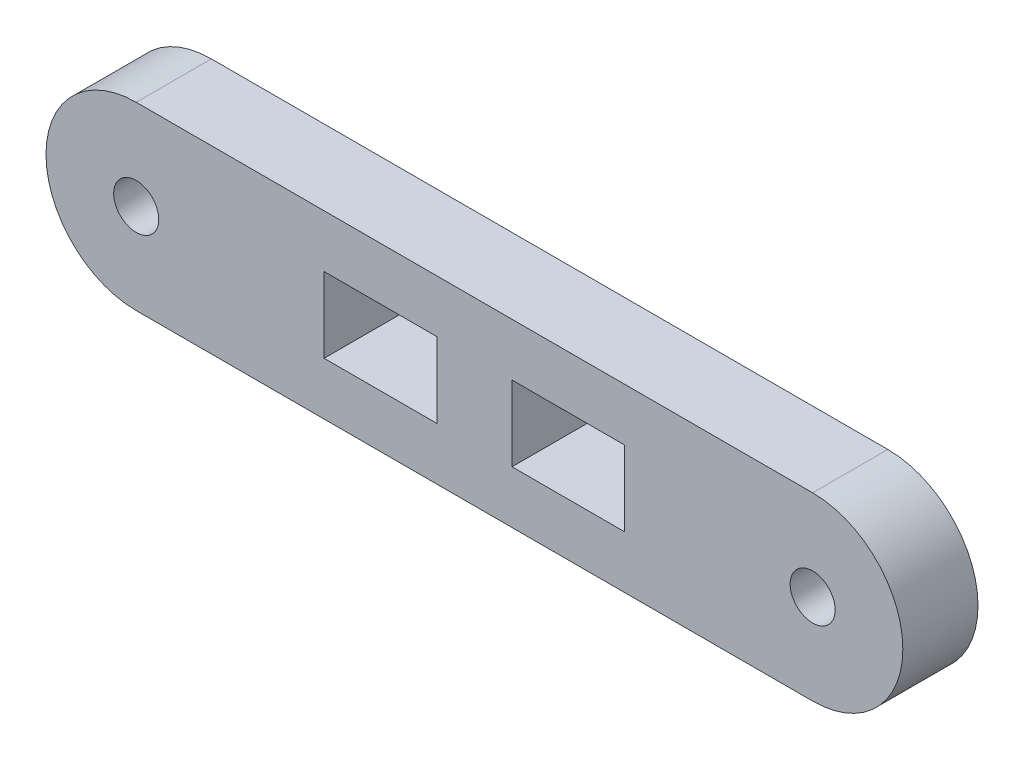
ISO-10303-21;
HEADER;
FILE_DESCRIPTION(('STEP AP214'),'2;1');
FILE_NAME('part.step','',(''),(''),'','','');
FILE_SCHEMA(('AUTOMOTIVE_DESIGN { 1 0 10303 214 1 1 1 1 }'));
ENDSEC;
DATA;
#1=APPLICATION_CONTEXT('core data for automotive mechanical design processes');
#2=APPLICATION_PROTOCOL_DEFINITION('international standard','automotive_design',2000,#1);
#3=PRODUCT_CONTEXT('',#1,'mechanical');
#4=PRODUCT('Part','Part','',(#3));
#5=PRODUCT_RELATED_PRODUCT_CATEGORY('part','',(#4));
#6=PRODUCT_DEFINITION_FORMATION('','',#4);
#7=PRODUCT_DEFINITION_CONTEXT('part definition',#1,'design');
#8=PRODUCT_DEFINITION('design','',#6,#7);
#9=PRODUCT_DEFINITION_SHAPE('','',#8);
#10=(LENGTH_UNIT() NAMED_UNIT(*) SI_UNIT(.MILLI.,.METRE.));
#11=(NAMED_UNIT(*) PLANE_ANGLE_UNIT() SI_UNIT($,.RADIAN.));
#12=(NAMED_UNIT(*) SI_UNIT($,.STERADIAN.) SOLID_ANGLE_UNIT());
#13=UNCERTAINTY_MEASURE_WITH_UNIT(LENGTH_MEASURE(1.E-05),#10,'distance_accuracy_value','');
#14=(GEOMETRIC_REPRESENTATION_CONTEXT(3) GLOBAL_UNCERTAINTY_ASSIGNED_CONTEXT((#13)) GLOBAL_UNIT_ASSIGNED_CONTEXT((#10,
#11,#12)) REPRESENTATION_CONTEXT('',''));
#15=CARTESIAN_POINT('',(0.,0.,0.));
#16=DIRECTION('',(0.,0.,1.));
#17=DIRECTION('',(1.,0.,0.));
#18=AXIS2_PLACEMENT_3D('',#15,#16,#17);
#19=CARTESIAN_POINT('',(0.,0.,5.));
#20=DIRECTION('',(0.,0.,1.));
#21=DIRECTION('',(1.,0.,0.));
#22=AXIS2_PLACEMENT_3D('',#19,#20,#21);
#23=PLANE('',#22);
#24=DIRECTION('',(-1.,0.,0.));
#25=VECTOR('',#24,1.);
#26=CARTESIAN_POINT('',(25.,2.50000000000001,5.));
#27=LINE('',#26,#25);
#28=CARTESIAN_POINT('',(32.5,2.49999999999999,5.));
#29=VERTEX_POINT('',#28);
#30=CARTESIAN_POINT('',(25.,2.50000000000001,5.));
#31=VERTEX_POINT('',#30);
#32=EDGE_CURVE('E160',#29,#31,#27,.T.);
#33=ORIENTED_EDGE('',*,*,#32,.F.);
#34=DIRECTION('',(0.,1.,0.));
#35=VECTOR('',#34,1.);
#36=CARTESIAN_POINT('',(32.5,2.49999999999999,5.));
#37=LINE('',#36,#35);
#38=CARTESIAN_POINT('',(32.5,-2.49999999999999,5.));
#39=VERTEX_POINT('',#38);
#40=EDGE_CURVE('E158',#39,#29,#37,.T.);
#41=ORIENTED_EDGE('',*,*,#40,.F.);
#42=DIRECTION('',(1.,0.,0.));
#43=VECTOR('',#42,1.);
#44=CARTESIAN_POINT('',(32.5,-2.49999999999999,5.));
#45=LINE('',#44,#43);
#46=CARTESIAN_POINT('',(25.,-2.49999999999999,5.));
#47=VERTEX_POINT('',#46);
#48=EDGE_CURVE('E166',#47,#39,#45,.T.);
#49=ORIENTED_EDGE('',*,*,#48,.F.);
#50=DIRECTION('',(0.,-1.,0.));
#51=VECTOR('',#50,1.);
#52=CARTESIAN_POINT('',(25.,-2.49999999999999,5.));
#53=LINE('',#52,#51);
#54=EDGE_CURVE('E163',#31,#47,#53,.T.);
#55=ORIENTED_EDGE('',*,*,#54,.F.);
#56=EDGE_LOOP('',(#33,#41,#49,#55));
#57=FACE_BOUND('',#56,.T.);
#58=CARTESIAN_POINT('',(45.,0.,5.));
#59=DIRECTION('',(0.,0.,1.));
#60=DIRECTION('',(1.,0.,0.));
#61=AXIS2_PLACEMENT_3D('',#58,#59,#60);
#62=CIRCLE('',#61,1.5);
#63=CARTESIAN_POINT('',(46.5,0.,5.));
#64=VERTEX_POINT('',#63);
#65=EDGE_CURVE('E195',#64,#64,#62,.T.);
#66=ORIENTED_EDGE('',*,*,#65,.F.);
#67=EDGE_LOOP('',(#66));
#68=FACE_BOUND('',#67,.T.);
#69=CARTESIAN_POINT('',(0.,0.,5.));
#70=DIRECTION('',(0.,0.,1.));
#71=DIRECTION('',(1.,0.,0.));
#72=AXIS2_PLACEMENT_3D('',#69,#70,#71);
#73=CIRCLE('',#72,5.99999999999998);
#74=CARTESIAN_POINT('',(0.,5.99999999999998,5.));
#75=VERTEX_POINT('',#74);
#76=CARTESIAN_POINT('',(0.,-5.99999999999998,5.));
#77=VERTEX_POINT('',#76);
#78=EDGE_CURVE('E201',#75,#77,#73,.T.);
#79=ORIENTED_EDGE('',*,*,#78,.T.);
#80=DIRECTION('',(1.,0.,0.));
#81=VECTOR('',#80,1.);
#82=CARTESIAN_POINT('',(0.,-5.99999999999998,5.));
#83=LINE('',#82,#81);
#84=CARTESIAN_POINT('',(45.,-5.99999999999999,5.));
#85=VERTEX_POINT('',#84);
#86=EDGE_CURVE('E204',#77,#85,#83,.T.);
#87=ORIENTED_EDGE('',*,*,#86,.T.);
#88=CARTESIAN_POINT('',(45.,0.,5.));
#89=DIRECTION('',(0.,0.,1.));
#90=DIRECTION('',(1.,0.,0.));
#91=AXIS2_PLACEMENT_3D('',#88,#89,#90);
#92=CIRCLE('',#91,5.99999999999999);
#93=CARTESIAN_POINT('',(45.,5.99999999999999,5.));
#94=VERTEX_POINT('',#93);
#95=EDGE_CURVE('E207',#85,#94,#92,.T.);
#96=ORIENTED_EDGE('',*,*,#95,.T.);
#97=DIRECTION('',(-1.,0.,0.));
#98=VECTOR('',#97,1.);
#99=CARTESIAN_POINT('',(0.,5.99999999999998,5.));
#100=LINE('',#99,#98);
#101=EDGE_CURVE('E209',#94,#75,#100,.T.);
#102=ORIENTED_EDGE('',*,*,#101,.T.);
#103=EDGE_LOOP('',(#79,#87,#96,#102));
#104=FACE_BOUND('',#103,.T.);
#105=CARTESIAN_POINT('',(0.,0.,5.));
#106=DIRECTION('',(0.,0.,1.));
#107=DIRECTION('',(1.,0.,0.));
#108=AXIS2_PLACEMENT_3D('',#105,#106,#107);
#109=CIRCLE('',#108,1.5);
#110=CARTESIAN_POINT('',(1.5,0.,5.));
#111=VERTEX_POINT('',#110);
#112=EDGE_CURVE('E189',#111,#111,#109,.T.);
#113=ORIENTED_EDGE('',*,*,#112,.F.);
#114=EDGE_LOOP('',(#113));
#115=FACE_BOUND('',#114,.T.);
#116=DIRECTION('',(0.,-1.,0.));
#117=VECTOR('',#116,1.);
#118=CARTESIAN_POINT('',(12.5,2.49999999999999,5.));
#119=LINE('',#118,#117);
#120=CARTESIAN_POINT('',(12.5,2.49999999999999,5.));
#121=VERTEX_POINT('',#120);
#122=CARTESIAN_POINT('',(12.5,-2.49999999999999,5.));
#123=VERTEX_POINT('',#122);
#124=EDGE_CURVE('E130',#121,#123,#119,.T.);
#125=ORIENTED_EDGE('',*,*,#124,.F.);
#126=DIRECTION('',(-1.,0.,0.));
#127=VECTOR('',#126,1.);
#128=CARTESIAN_POINT('',(20.,2.49999999999999,5.));
#129=LINE('',#128,#127);
#130=CARTESIAN_POINT('',(20.,2.49999999999999,5.));
#131=VERTEX_POINT('',#130);
#132=EDGE_CURVE('E122',#131,#121,#129,.T.);
#133=ORIENTED_EDGE('',*,*,#132,.F.);
#134=DIRECTION('',(0.,1.,0.));
#135=VECTOR('',#134,1.);
#136=CARTESIAN_POINT('',(20.,-2.5,5.));
#137=LINE('',#136,#135);
#138=CARTESIAN_POINT('',(20.,-2.5,5.));
#139=VERTEX_POINT('',#138);
#140=EDGE_CURVE('E144',#139,#131,#137,.T.);
#141=ORIENTED_EDGE('',*,*,#140,.F.);
#142=DIRECTION('',(1.,0.,0.));
#143=VECTOR('',#142,1.);
#144=CARTESIAN_POINT('',(12.5,-2.49999999999999,5.));
#145=LINE('',#144,#143);
#146=EDGE_CURVE('E142',#123,#139,#145,.T.);
#147=ORIENTED_EDGE('',*,*,#146,.F.);
#148=EDGE_LOOP('',(#125,#133,#141,#147));
#149=FACE_BOUND('',#148,.T.);
#150=ADVANCED_FACE('F33',(#57,#68,#104,#115,#149),#23,.T.);
#151=CARTESIAN_POINT('',(0.,0.,0.));
#152=DIRECTION('',(0.,0.,1.));
#153=DIRECTION('',(1.,0.,0.));
#154=AXIS2_PLACEMENT_3D('',#151,#152,#153);
#155=PLANE('',#154);
#156=DIRECTION('',(0.,1.,0.));
#157=VECTOR('',#156,1.);
#158=CARTESIAN_POINT('',(32.5,2.49999999999999,0.));
#159=LINE('',#158,#157);
#160=CARTESIAN_POINT('',(32.5,-2.49999999999999,0.));
#161=VERTEX_POINT('',#160);
#162=CARTESIAN_POINT('',(32.5,2.49999999999999,0.));
#163=VERTEX_POINT('',#162);
#164=EDGE_CURVE('E138',#161,#163,#159,.T.);
#165=ORIENTED_EDGE('',*,*,#164,.T.);
#166=DIRECTION('',(-1.,0.,0.));
#167=VECTOR('',#166,1.);
#168=CARTESIAN_POINT('',(25.,2.50000000000001,0.));
#169=LINE('',#168,#167);
#170=CARTESIAN_POINT('',(25.,2.50000000000001,0.));
#171=VERTEX_POINT('',#170);
#172=EDGE_CURVE('E171',#163,#171,#169,.T.);
#173=ORIENTED_EDGE('',*,*,#172,.T.);
#174=DIRECTION('',(0.,-1.,0.));
#175=VECTOR('',#174,1.);
#176=CARTESIAN_POINT('',(25.,-2.49999999999999,0.));
#177=LINE('',#176,#175);
#178=CARTESIAN_POINT('',(25.,-2.49999999999999,0.));
#179=VERTEX_POINT('',#178);
#180=EDGE_CURVE('E174',#171,#179,#177,.T.);
#181=ORIENTED_EDGE('',*,*,#180,.T.);
#182=DIRECTION('',(1.,0.,0.));
#183=VECTOR('',#182,1.);
#184=CARTESIAN_POINT('',(32.5,-2.49999999999999,0.));
#185=LINE('',#184,#183);
#186=EDGE_CURVE('E161',#179,#161,#185,.T.);
#187=ORIENTED_EDGE('',*,*,#186,.T.);
#188=EDGE_LOOP('',(#165,#173,#181,#187));
#189=FACE_BOUND('',#188,.T.);
#190=CARTESIAN_POINT('',(45.,0.,0.));
#191=DIRECTION('',(0.,0.,1.));
#192=DIRECTION('',(1.,0.,0.));
#193=AXIS2_PLACEMENT_3D('',#190,#191,#192);
#194=CIRCLE('',#193,1.5);
#195=CARTESIAN_POINT('',(46.5,0.,0.));
#196=VERTEX_POINT('',#195);
#197=EDGE_CURVE('E192',#196,#196,#194,.T.);
#198=ORIENTED_EDGE('',*,*,#197,.T.);
#199=EDGE_LOOP('',(#198));
#200=FACE_BOUND('',#199,.T.);
#201=CARTESIAN_POINT('',(0.,0.,0.));
#202=DIRECTION('',(0.,0.,1.));
#203=DIRECTION('',(1.,0.,0.));
#204=AXIS2_PLACEMENT_3D('',#201,#202,#203);
#205=CIRCLE('',#204,5.99999999999998);
#206=CARTESIAN_POINT('',(0.,5.99999999999998,0.));
#207=VERTEX_POINT('',#206);
#208=CARTESIAN_POINT('',(0.,-5.99999999999998,0.));
#209=VERTEX_POINT('',#208);
#210=EDGE_CURVE('E198',#207,#209,#205,.T.);
#211=ORIENTED_EDGE('',*,*,#210,.F.);
#212=DIRECTION('',(-1.,0.,0.));
#213=VECTOR('',#212,1.);
#214=CARTESIAN_POINT('',(0.,5.99999999999998,0.));
#215=LINE('',#214,#213);
#216=CARTESIAN_POINT('',(45.,5.99999999999999,0.));
#217=VERTEX_POINT('',#216);
#218=EDGE_CURVE('E205',#217,#207,#215,.T.);
#219=ORIENTED_EDGE('',*,*,#218,.F.);
#220=CARTESIAN_POINT('',(45.,0.,0.));
#221=DIRECTION('',(0.,0.,1.));
#222=DIRECTION('',(1.,0.,0.));
#223=AXIS2_PLACEMENT_3D('',#220,#221,#222);
#224=CIRCLE('',#223,5.99999999999999);
#225=CARTESIAN_POINT('',(45.,-5.99999999999999,0.));
#226=VERTEX_POINT('',#225);
#227=EDGE_CURVE('E216',#226,#217,#224,.T.);
#228=ORIENTED_EDGE('',*,*,#227,.F.);
#229=DIRECTION('',(1.,0.,0.));
#230=VECTOR('',#229,1.);
#231=CARTESIAN_POINT('',(0.,-5.99999999999998,0.));
#232=LINE('',#231,#230);
#233=EDGE_CURVE('E214',#209,#226,#232,.T.);
#234=ORIENTED_EDGE('',*,*,#233,.F.);
#235=EDGE_LOOP('',(#211,#219,#228,#234));
#236=FACE_BOUND('',#235,.T.);
#237=CARTESIAN_POINT('',(0.,0.,0.));
#238=DIRECTION('',(0.,0.,1.));
#239=DIRECTION('',(1.,0.,0.));
#240=AXIS2_PLACEMENT_3D('',#237,#238,#239);
#241=CIRCLE('',#240,1.5);
#242=CARTESIAN_POINT('',(1.5,0.,0.));
#243=VERTEX_POINT('',#242);
#244=EDGE_CURVE('E188',#243,#243,#241,.T.);
#245=ORIENTED_EDGE('',*,*,#244,.T.);
#246=EDGE_LOOP('',(#245));
#247=FACE_BOUND('',#246,.T.);
#248=DIRECTION('',(-1.,0.,0.));
#249=VECTOR('',#248,1.);
#250=CARTESIAN_POINT('',(20.,2.49999999999999,0.));
#251=LINE('',#250,#249);
#252=CARTESIAN_POINT('',(20.,2.49999999999999,0.));
#253=VERTEX_POINT('',#252);
#254=CARTESIAN_POINT('',(12.5,2.49999999999999,0.));
#255=VERTEX_POINT('',#254);
#256=EDGE_CURVE('E56',#253,#255,#251,.T.);
#257=ORIENTED_EDGE('',*,*,#256,.T.);
#258=DIRECTION('',(0.,-1.,0.));
#259=VECTOR('',#258,1.);
#260=CARTESIAN_POINT('',(12.5,2.49999999999999,0.));
#261=LINE('',#260,#259);
#262=CARTESIAN_POINT('',(12.5,-2.49999999999999,0.));
#263=VERTEX_POINT('',#262);
#264=EDGE_CURVE('E137',#255,#263,#261,.T.);
#265=ORIENTED_EDGE('',*,*,#264,.T.);
#266=DIRECTION('',(1.,0.,0.));
#267=VECTOR('',#266,1.);
#268=CARTESIAN_POINT('',(12.5,-2.49999999999999,0.));
#269=LINE('',#268,#267);
#270=CARTESIAN_POINT('',(20.,-2.5,0.));
#271=VERTEX_POINT('',#270);
#272=EDGE_CURVE('E150',#263,#271,#269,.T.);
#273=ORIENTED_EDGE('',*,*,#272,.T.);
#274=DIRECTION('',(0.,1.,0.));
#275=VECTOR('',#274,1.);
#276=CARTESIAN_POINT('',(20.,-2.5,0.));
#277=LINE('',#276,#275);
#278=EDGE_CURVE('E131',#271,#253,#277,.T.);
#279=ORIENTED_EDGE('',*,*,#278,.T.);
#280=EDGE_LOOP('',(#257,#265,#273,#279));
#281=FACE_BOUND('',#280,.T.);
#282=ADVANCED_FACE('F234',(#189,#200,#236,#247,#281),#155,.F.);
#283=CARTESIAN_POINT('',(0.,0.,5.));
#284=DIRECTION('',(0.,0.,-1.));
#285=DIRECTION('',(-1.,0.,0.));
#286=AXIS2_PLACEMENT_3D('',#283,#284,#285);
#287=CYLINDRICAL_SURFACE('',#286,5.99999999999998);
#288=ORIENTED_EDGE('',*,*,#210,.T.);
#289=DIRECTION('',(0.,0.,-1.));
#290=VECTOR('',#289,1.);
#291=CARTESIAN_POINT('',(0.,-5.99999999999998,5.));
#292=LINE('',#291,#290);
#293=EDGE_CURVE('E11',#77,#209,#292,.T.);
#294=ORIENTED_EDGE('',*,*,#293,.F.);
#295=ORIENTED_EDGE('',*,*,#78,.F.);
#296=DIRECTION('',(0.,0.,-1.));
#297=VECTOR('',#296,1.);
#298=CARTESIAN_POINT('',(0.,5.99999999999998,5.));
#299=LINE('',#298,#297);
#300=EDGE_CURVE('E211',#75,#207,#299,.T.);
#301=ORIENTED_EDGE('',*,*,#300,.T.);
#302=EDGE_LOOP('',(#288,#294,#295,#301));
#303=FACE_BOUND('',#302,.T.);
#304=ADVANCED_FACE('F35',(#303),#287,.T.);
#305=CARTESIAN_POINT('',(0.,-5.99999999999998,5.));
#306=DIRECTION('',(0.,1.,0.));
#307=DIRECTION('',(-1.,0.,0.));
#308=AXIS2_PLACEMENT_3D('',#305,#306,#307);
#309=PLANE('',#308);
#310=ORIENTED_EDGE('',*,*,#233,.T.);
#311=DIRECTION('',(0.,0.,-1.));
#312=VECTOR('',#311,1.);
#313=CARTESIAN_POINT('',(45.,-5.99999999999999,5.));
#314=LINE('',#313,#312);
#315=EDGE_CURVE('E41',#85,#226,#314,.T.);
#316=ORIENTED_EDGE('',*,*,#315,.F.);
#317=ORIENTED_EDGE('',*,*,#86,.F.);
#318=ORIENTED_EDGE('',*,*,#293,.T.);
#319=EDGE_LOOP('',(#310,#316,#317,#318));
#320=FACE_BOUND('',#319,.T.);
#321=ADVANCED_FACE('F245',(#320),#309,.F.);
#322=CARTESIAN_POINT('',(45.,0.,5.));
#323=DIRECTION('',(0.,0.,-1.));
#324=DIRECTION('',(-1.,0.,0.));
#325=AXIS2_PLACEMENT_3D('',#322,#323,#324);
#326=CYLINDRICAL_SURFACE('',#325,5.99999999999999);
#327=ORIENTED_EDGE('',*,*,#227,.T.);
#328=DIRECTION('',(0.,0.,-1.));
#329=VECTOR('',#328,1.);
#330=CARTESIAN_POINT('',(45.,5.99999999999999,5.));
#331=LINE('',#330,#329);
#332=EDGE_CURVE('E221',#94,#217,#331,.T.);
#333=ORIENTED_EDGE('',*,*,#332,.F.);
#334=ORIENTED_EDGE('',*,*,#95,.F.);
#335=ORIENTED_EDGE('',*,*,#315,.T.);
#336=EDGE_LOOP('',(#327,#333,#334,#335));
#337=FACE_BOUND('',#336,.T.);
#338=ADVANCED_FACE('F228',(#337),#326,.T.);
#339=CARTESIAN_POINT('',(0.,5.99999999999998,5.));
#340=DIRECTION('',(0.,-1.,0.));
#341=DIRECTION('',(1.,0.,0.));
#342=AXIS2_PLACEMENT_3D('',#339,#340,#341);
#343=PLANE('',#342);
#344=ORIENTED_EDGE('',*,*,#218,.T.);
#345=ORIENTED_EDGE('',*,*,#300,.F.);
#346=ORIENTED_EDGE('',*,*,#101,.F.);
#347=ORIENTED_EDGE('',*,*,#332,.T.);
#348=EDGE_LOOP('',(#344,#345,#346,#347));
#349=FACE_BOUND('',#348,.T.);
#350=ADVANCED_FACE('F238',(#349),#343,.F.);
#351=CARTESIAN_POINT('',(45.,0.,5.));
#352=DIRECTION('',(0.,0.,-1.));
#353=DIRECTION('',(-1.,0.,0.));
#354=AXIS2_PLACEMENT_3D('',#351,#352,#353);
#355=CYLINDRICAL_SURFACE('',#354,1.5);
#356=ORIENTED_EDGE('',*,*,#65,.T.);
#357=EDGE_LOOP('',(#356));
#358=FACE_BOUND('',#357,.T.);
#359=ORIENTED_EDGE('',*,*,#197,.F.);
#360=EDGE_LOOP('',(#359));
#361=FACE_BOUND('',#360,.T.);
#362=ADVANCED_FACE('F263',(#358,#361),#355,.F.);
#363=CARTESIAN_POINT('',(0.,0.,5.));
#364=DIRECTION('',(0.,0.,-1.));
#365=DIRECTION('',(-1.,0.,0.));
#366=AXIS2_PLACEMENT_3D('',#363,#364,#365);
#367=CYLINDRICAL_SURFACE('',#366,1.5);
#368=ORIENTED_EDGE('',*,*,#112,.T.);
#369=EDGE_LOOP('',(#368));
#370=FACE_BOUND('',#369,.T.);
#371=ORIENTED_EDGE('',*,*,#244,.F.);
#372=EDGE_LOOP('',(#371));
#373=FACE_BOUND('',#372,.T.);
#374=ADVANCED_FACE('F270',(#370,#373),#367,.F.);
#375=CARTESIAN_POINT('',(32.5,2.49999999999999,5.));
#376=DIRECTION('',(-1.,0.,0.));
#377=DIRECTION('',(0.,0.,1.));
#378=AXIS2_PLACEMENT_3D('',#375,#376,#377);
#379=PLANE('',#378);
#380=ORIENTED_EDGE('',*,*,#164,.F.);
#381=DIRECTION('',(0.,0.,-1.));
#382=VECTOR('',#381,1.);
#383=CARTESIAN_POINT('',(32.5,-2.49999999999999,5.));
#384=LINE('',#383,#382);
#385=EDGE_CURVE('E168',#39,#161,#384,.T.);
#386=ORIENTED_EDGE('',*,*,#385,.F.);
#387=ORIENTED_EDGE('',*,*,#40,.T.);
#388=DIRECTION('',(0.,0.,-1.));
#389=VECTOR('',#388,1.);
#390=CARTESIAN_POINT('',(32.5,2.49999999999999,5.));
#391=LINE('',#390,#389);
#392=EDGE_CURVE('E185',#29,#163,#391,.T.);
#393=ORIENTED_EDGE('',*,*,#392,.T.);
#394=EDGE_LOOP('',(#380,#386,#387,#393));
#395=FACE_BOUND('',#394,.T.);
#396=ADVANCED_FACE('F275',(#395),#379,.T.);
#397=CARTESIAN_POINT('',(25.,2.50000000000001,5.));
#398=DIRECTION('',(0.,-1.,0.));
#399=DIRECTION('',(1.,0.,0.));
#400=AXIS2_PLACEMENT_3D('',#397,#398,#399);
#401=PLANE('',#400);
#402=ORIENTED_EDGE('',*,*,#172,.F.);
#403=ORIENTED_EDGE('',*,*,#392,.F.);
#404=ORIENTED_EDGE('',*,*,#32,.T.);
#405=DIRECTION('',(0.,0.,-1.));
#406=VECTOR('',#405,1.);
#407=CARTESIAN_POINT('',(25.,2.50000000000001,5.));
#408=LINE('',#407,#406);
#409=EDGE_CURVE('E183',#31,#171,#408,.T.);
#410=ORIENTED_EDGE('',*,*,#409,.T.);
#411=EDGE_LOOP('',(#402,#403,#404,#410));
#412=FACE_BOUND('',#411,.T.);
#413=ADVANCED_FACE('F284',(#412),#401,.T.);
#414=CARTESIAN_POINT('',(25.,-2.49999999999999,5.));
#415=DIRECTION('',(1.,0.,0.));
#416=DIRECTION('',(0.,0.,-1.));
#417=AXIS2_PLACEMENT_3D('',#414,#415,#416);
#418=PLANE('',#417);
#419=ORIENTED_EDGE('',*,*,#180,.F.);
#420=ORIENTED_EDGE('',*,*,#409,.F.);
#421=ORIENTED_EDGE('',*,*,#54,.T.);
#422=DIRECTION('',(0.,0.,-1.));
#423=VECTOR('',#422,1.);
#424=CARTESIAN_POINT('',(25.,-2.49999999999999,5.));
#425=LINE('',#424,#423);
#426=EDGE_CURVE('E181',#47,#179,#425,.T.);
#427=ORIENTED_EDGE('',*,*,#426,.T.);
#428=EDGE_LOOP('',(#419,#420,#421,#427));
#429=FACE_BOUND('',#428,.T.);
#430=ADVANCED_FACE('F291',(#429),#418,.T.);
#431=CARTESIAN_POINT('',(32.5,-2.49999999999999,5.));
#432=DIRECTION('',(0.,1.,0.));
#433=DIRECTION('',(-1.,0.,0.));
#434=AXIS2_PLACEMENT_3D('',#431,#432,#433);
#435=PLANE('',#434);
#436=ORIENTED_EDGE('',*,*,#186,.F.);
#437=ORIENTED_EDGE('',*,*,#426,.F.);
#438=ORIENTED_EDGE('',*,*,#48,.T.);
#439=ORIENTED_EDGE('',*,*,#385,.T.);
#440=EDGE_LOOP('',(#436,#437,#438,#439));
#441=FACE_BOUND('',#440,.T.);
#442=ADVANCED_FACE('F295',(#441),#435,.T.);
#443=CARTESIAN_POINT('',(20.,2.49999999999999,5.));
#444=DIRECTION('',(0.,-1.,0.));
#445=DIRECTION('',(1.,0.,0.));
#446=AXIS2_PLACEMENT_3D('',#443,#444,#445);
#447=PLANE('',#446);
#448=ORIENTED_EDGE('',*,*,#256,.F.);
#449=DIRECTION('',(0.,0.,-1.));
#450=VECTOR('',#449,1.);
#451=CARTESIAN_POINT('',(20.,2.49999999999999,5.));
#452=LINE('',#451,#450);
#453=EDGE_CURVE('E126',#131,#253,#452,.T.);
#454=ORIENTED_EDGE('',*,*,#453,.F.);
#455=ORIENTED_EDGE('',*,*,#132,.T.);
#456=DIRECTION('',(0.,0.,-1.));
#457=VECTOR('',#456,1.);
#458=CARTESIAN_POINT('',(12.5,2.49999999999999,5.));
#459=LINE('',#458,#457);
#460=EDGE_CURVE('E125',#121,#255,#459,.T.);
#461=ORIENTED_EDGE('',*,*,#460,.T.);
#462=EDGE_LOOP('',(#448,#454,#455,#461));
#463=FACE_BOUND('',#462,.T.);
#464=ADVANCED_FACE('F124',(#463),#447,.T.);
#465=CARTESIAN_POINT('',(12.5,2.49999999999999,5.));
#466=DIRECTION('',(1.,0.,0.));
#467=DIRECTION('',(0.,0.,-1.));
#468=AXIS2_PLACEMENT_3D('',#465,#466,#467);
#469=PLANE('',#468);
#470=ORIENTED_EDGE('',*,*,#264,.F.);
#471=ORIENTED_EDGE('',*,*,#460,.F.);
#472=ORIENTED_EDGE('',*,*,#124,.T.);
#473=DIRECTION('',(0.,0.,-1.));
#474=VECTOR('',#473,1.);
#475=CARTESIAN_POINT('',(12.5,-2.49999999999999,5.));
#476=LINE('',#475,#474);
#477=EDGE_CURVE('E139',#123,#263,#476,.T.);
#478=ORIENTED_EDGE('',*,*,#477,.T.);
#479=EDGE_LOOP('',(#470,#471,#472,#478));
#480=FACE_BOUND('',#479,.T.);
#481=ADVANCED_FACE('F134',(#480),#469,.T.);
#482=CARTESIAN_POINT('',(12.5,-2.49999999999999,5.));
#483=DIRECTION('',(0.,1.,0.));
#484=DIRECTION('',(-1.,0.,0.));
#485=AXIS2_PLACEMENT_3D('',#482,#483,#484);
#486=PLANE('',#485);
#487=ORIENTED_EDGE('',*,*,#272,.F.);
#488=ORIENTED_EDGE('',*,*,#477,.F.);
#489=ORIENTED_EDGE('',*,*,#146,.T.);
#490=DIRECTION('',(0.,0.,-1.));
#491=VECTOR('',#490,1.);
#492=CARTESIAN_POINT('',(20.,-2.5,5.));
#493=LINE('',#492,#491);
#494=EDGE_CURVE('E48',#139,#271,#493,.T.);
#495=ORIENTED_EDGE('',*,*,#494,.T.);
#496=EDGE_LOOP('',(#487,#488,#489,#495));
#497=FACE_BOUND('',#496,.T.);
#498=ADVANCED_FACE('F304',(#497),#486,.T.);
#499=CARTESIAN_POINT('',(20.,-2.5,5.));
#500=DIRECTION('',(-1.,0.,0.));
#501=DIRECTION('',(0.,-1.,0.));
#502=AXIS2_PLACEMENT_3D('',#499,#500,#501);
#503=PLANE('',#502);
#504=ORIENTED_EDGE('',*,*,#278,.F.);
#505=ORIENTED_EDGE('',*,*,#494,.F.);
#506=ORIENTED_EDGE('',*,*,#140,.T.);
#507=ORIENTED_EDGE('',*,*,#453,.T.);
#508=EDGE_LOOP('',(#504,#505,#506,#507));
#509=FACE_BOUND('',#508,.T.);
#510=ADVANCED_FACE('F307',(#509),#503,.T.);
#511=CLOSED_SHELL('',(#150,#282,#304,#321,#338,#350,#362,#374,#396,#413,#430,#442,#464,#481,
#498,#510));
#512=MANIFOLD_SOLID_BREP('B2',#511);
#513=ADVANCED_BREP_SHAPE_REPRESENTATION('',(#18,#512),#14);
#514=SHAPE_DEFINITION_REPRESENTATION(#9,#513);
ENDSEC;
END-ISO-10303-21;
